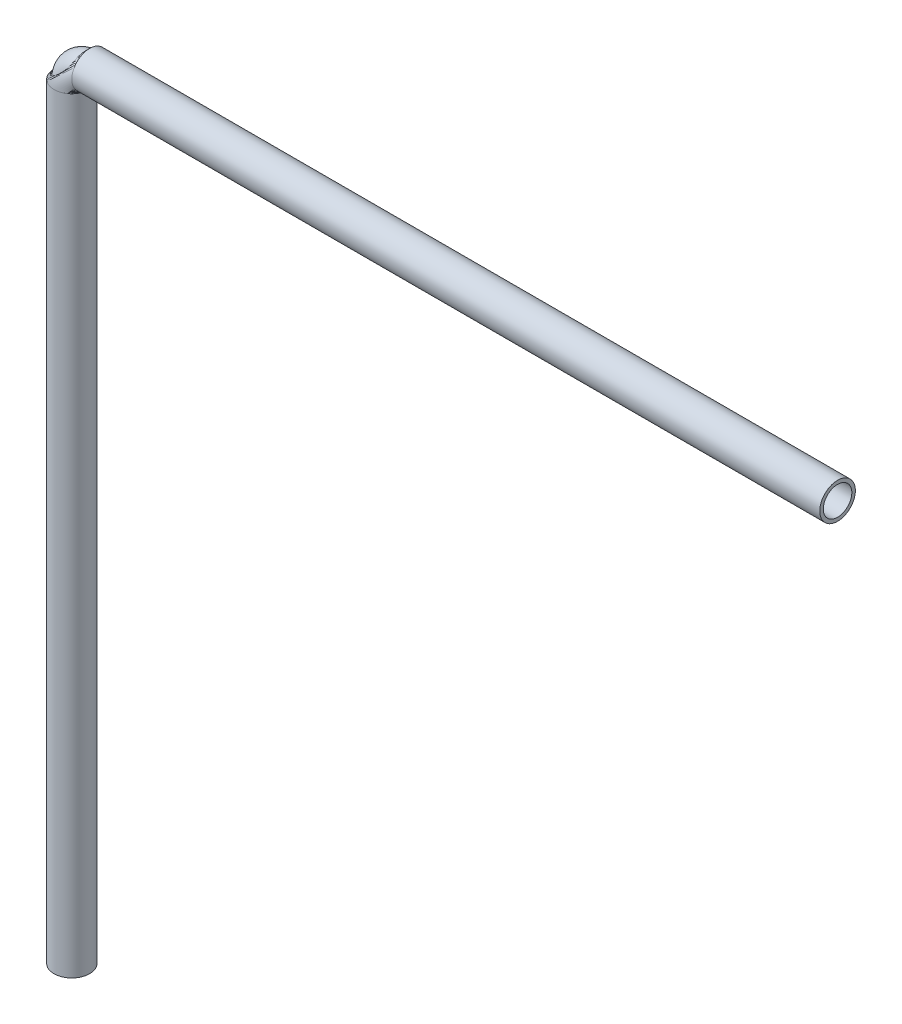
ISO-10303-21;
HEADER;
FILE_DESCRIPTION(('STEP AP214'),'2;1');
FILE_NAME('part.step','',(''),(''),'','','');
FILE_SCHEMA(('AUTOMOTIVE_DESIGN { 1 0 10303 214 1 1 1 1 }'));
ENDSEC;
DATA;
#1=APPLICATION_CONTEXT('core data for automotive mechanical design processes');
#2=APPLICATION_PROTOCOL_DEFINITION('international standard','automotive_design',2000,#1);
#3=PRODUCT_CONTEXT('',#1,'mechanical');
#4=PRODUCT('Part','Part','',(#3));
#5=PRODUCT_RELATED_PRODUCT_CATEGORY('part','',(#4));
#6=PRODUCT_DEFINITION_FORMATION('','',#4);
#7=PRODUCT_DEFINITION_CONTEXT('part definition',#1,'design');
#8=PRODUCT_DEFINITION('design','',#6,#7);
#9=PRODUCT_DEFINITION_SHAPE('','',#8);
#10=(LENGTH_UNIT() NAMED_UNIT(*) SI_UNIT(.MILLI.,.METRE.));
#11=(NAMED_UNIT(*) PLANE_ANGLE_UNIT() SI_UNIT($,.RADIAN.));
#12=(NAMED_UNIT(*) SI_UNIT($,.STERADIAN.) SOLID_ANGLE_UNIT());
#13=UNCERTAINTY_MEASURE_WITH_UNIT(LENGTH_MEASURE(1.E-05),#10,'distance_accuracy_value','');
#14=(GEOMETRIC_REPRESENTATION_CONTEXT(3) GLOBAL_UNCERTAINTY_ASSIGNED_CONTEXT((#13)) GLOBAL_UNIT_ASSIGNED_CONTEXT((#10,
#11,#12)) REPRESENTATION_CONTEXT('',''));
#15=CARTESIAN_POINT('',(0.,0.,0.));
#16=DIRECTION('',(0.,0.,1.));
#17=DIRECTION('',(1.,0.,0.));
#18=AXIS2_PLACEMENT_3D('',#15,#16,#17);
#19=CARTESIAN_POINT('',(0.,0.,0.));
#20=DIRECTION('',(0.,1.,0.));
#21=DIRECTION('',(0.,0.,1.));
#22=AXIS2_PLACEMENT_3D('',#19,#20,#21);
#23=CYLINDRICAL_SURFACE('',#22,0.5);
#24=CARTESIAN_POINT('',(0.,21.5,0.));
#25=DIRECTION('',(0.,1.,0.));
#26=DIRECTION('',(0.,0.,1.));
#27=AXIS2_PLACEMENT_3D('',#24,#25,#26);
#28=CIRCLE('',#27,0.5);
#29=CARTESIAN_POINT('',(0.5,21.5,0.));
#30=VERTEX_POINT('',#29);
#31=EDGE_CURVE('E65',#30,#30,#28,.T.);
#32=ORIENTED_EDGE('',*,*,#31,.F.);
#33=EDGE_LOOP('',(#32));
#34=FACE_BOUND('',#33,.T.);
#35=CARTESIAN_POINT('',(0.,0.,0.));
#36=DIRECTION('',(0.,1.,0.));
#37=DIRECTION('',(0.,0.,1.));
#38=AXIS2_PLACEMENT_3D('',#35,#36,#37);
#39=CIRCLE('',#38,0.5);
#40=CARTESIAN_POINT('',(0.,0.,0.5));
#41=VERTEX_POINT('',#40);
#42=EDGE_CURVE('E50',#41,#41,#39,.T.);
#43=ORIENTED_EDGE('',*,*,#42,.T.);
#44=EDGE_LOOP('',(#43));
#45=FACE_BOUND('',#44,.T.);
#46=ADVANCED_FACE('F35',(#34,#45),#23,.T.);
#47=CARTESIAN_POINT('',(0.5,21.5,0.));
#48=DIRECTION('',(0.,0.,-1.));
#49=DIRECTION('',(-1.,0.,0.));
#50=AXIS2_PLACEMENT_3D('',#47,#48,#49);
#51=TOROIDAL_SURFACE('',#50,0.5,0.5);
#52=CARTESIAN_POINT('',(0.5,22.,0.));
#53=DIRECTION('',(1.,0.,0.));
#54=DIRECTION('',(0.,0.,1.));
#55=AXIS2_PLACEMENT_3D('',#52,#53,#54);
#56=CIRCLE('',#55,0.5);
#57=EDGE_CURVE('E39',#30,#30,#56,.T.);
#58=ORIENTED_EDGE('',*,*,#57,.F.);
#59=ORIENTED_EDGE('',*,*,#31,.T.);
#60=EDGE_LOOP('',(#58,#59));
#61=FACE_BOUND('',#60,.T.);
#62=ADVANCED_FACE('F91',(#61),#51,.T.);
#63=CARTESIAN_POINT('',(0.5,22.,0.));
#64=DIRECTION('',(1.,0.,0.));
#65=DIRECTION('',(0.,0.,-1.));
#66=AXIS2_PLACEMENT_3D('',#63,#64,#65);
#67=CYLINDRICAL_SURFACE('',#66,0.5);
#68=CARTESIAN_POINT('',(21.5,22.,0.));
#69=DIRECTION('',(1.,0.,0.));
#70=DIRECTION('',(0.,0.,1.));
#71=AXIS2_PLACEMENT_3D('',#68,#69,#70);
#72=CIRCLE('',#71,0.5);
#73=CARTESIAN_POINT('',(21.5,22.,0.5));
#74=VERTEX_POINT('',#73);
#75=EDGE_CURVE('E56',#74,#74,#72,.T.);
#76=ORIENTED_EDGE('',*,*,#75,.F.);
#77=EDGE_LOOP('',(#76));
#78=FACE_BOUND('',#77,.T.);
#79=ORIENTED_EDGE('',*,*,#57,.T.);
#80=EDGE_LOOP('',(#79));
#81=FACE_BOUND('',#80,.T.);
#82=ADVANCED_FACE('F37',(#78,#81),#67,.T.);
#83=CARTESIAN_POINT('',(0.,0.,0.));
#84=DIRECTION('',(0.,1.,0.));
#85=DIRECTION('',(0.,0.,1.));
#86=AXIS2_PLACEMENT_3D('',#83,#84,#85);
#87=PLANE('',#86);
#88=CARTESIAN_POINT('',(0.,0.,0.));
#89=DIRECTION('',(0.,1.,0.));
#90=DIRECTION('',(0.,0.,1.));
#91=AXIS2_PLACEMENT_3D('',#88,#89,#90);
#92=CIRCLE('',#91,0.4);
#93=CARTESIAN_POINT('',(0.,0.,0.4));
#94=VERTEX_POINT('',#93);
#95=EDGE_CURVE('E82',#94,#94,#92,.F.);
#96=ORIENTED_EDGE('',*,*,#95,.F.);
#97=EDGE_LOOP('',(#96));
#98=FACE_BOUND('',#97,.T.);
#99=ORIENTED_EDGE('',*,*,#42,.F.);
#100=EDGE_LOOP('',(#99));
#101=FACE_BOUND('',#100,.T.);
#102=ADVANCED_FACE('F97',(#98,#101),#87,.F.);
#103=CARTESIAN_POINT('',(21.5,22.,0.));
#104=DIRECTION('',(1.,0.,0.));
#105=DIRECTION('',(0.,0.,1.));
#106=AXIS2_PLACEMENT_3D('',#103,#104,#105);
#107=PLANE('',#106);
#108=CARTESIAN_POINT('',(21.5,22.,0.));
#109=DIRECTION('',(1.,0.,0.));
#110=DIRECTION('',(0.,0.,1.));
#111=AXIS2_PLACEMENT_3D('',#108,#109,#110);
#112=CIRCLE('',#111,0.4);
#113=CARTESIAN_POINT('',(21.5,22.,0.4));
#114=VERTEX_POINT('',#113);
#115=EDGE_CURVE('E11',#114,#114,#112,.F.);
#116=ORIENTED_EDGE('',*,*,#115,.T.);
#117=EDGE_LOOP('',(#116));
#118=FACE_BOUND('',#117,.T.);
#119=ORIENTED_EDGE('',*,*,#75,.T.);
#120=EDGE_LOOP('',(#119));
#121=FACE_BOUND('',#120,.T.);
#122=ADVANCED_FACE('F68',(#118,#121),#107,.T.);
#123=CARTESIAN_POINT('',(0.,0.,0.));
#124=DIRECTION('',(0.,1.,0.));
#125=DIRECTION('',(0.,0.,1.));
#126=AXIS2_PLACEMENT_3D('',#123,#124,#125);
#127=CYLINDRICAL_SURFACE('',#126,0.4);
#128=CARTESIAN_POINT('',(0.,21.5,0.));
#129=DIRECTION('',(0.,1.,0.));
#130=DIRECTION('',(0.,0.,1.));
#131=AXIS2_PLACEMENT_3D('',#128,#129,#130);
#132=CIRCLE('',#131,0.4);
#133=CARTESIAN_POINT('',(-0.4,21.5,0.));
#134=VERTEX_POINT('',#133);
#135=EDGE_CURVE('E79',#134,#134,#132,.F.);
#136=ORIENTED_EDGE('',*,*,#135,.F.);
#137=EDGE_LOOP('',(#136));
#138=FACE_BOUND('',#137,.T.);
#139=ORIENTED_EDGE('',*,*,#95,.T.);
#140=EDGE_LOOP('',(#139));
#141=FACE_BOUND('',#140,.T.);
#142=ADVANCED_FACE('F104',(#138,#141),#127,.F.);
#143=CARTESIAN_POINT('',(0.5,21.5,0.));
#144=DIRECTION('',(0.,0.,-1.));
#145=DIRECTION('',(-1.,0.,0.));
#146=AXIS2_PLACEMENT_3D('',#143,#144,#145);
#147=TOROIDAL_SURFACE('',#146,0.5,0.4);
#148=CARTESIAN_POINT('',(0.5,22.,0.));
#149=DIRECTION('',(1.,0.,0.));
#150=DIRECTION('',(0.,0.,1.));
#151=AXIS2_PLACEMENT_3D('',#148,#149,#150);
#152=CIRCLE('',#151,0.4);
#153=CARTESIAN_POINT('',(0.5,22.4,0.));
#154=VERTEX_POINT('',#153);
#155=EDGE_CURVE('E44',#154,#154,#152,.F.);
#156=CARTESIAN_POINT('',(0.5,21.5,0.));
#157=DIRECTION('',(0.,0.,-1.));
#158=DIRECTION('',(-1.,0.,0.));
#159=AXIS2_PLACEMENT_3D('',#156,#157,#158);
#160=CIRCLE('',#159,0.9);
#161=EDGE_CURVE('',#134,#154,#160,.T.);
#162=ORIENTED_EDGE('',*,*,#135,.T.);
#163=ORIENTED_EDGE('',*,*,#155,.F.);
#164=ORIENTED_EDGE('',*,*,#161,.T.);
#165=ORIENTED_EDGE('',*,*,#161,.F.);
#166=EDGE_LOOP('',(#162,#164,#163,#165));
#167=FACE_BOUND('',#166,.T.);
#168=ADVANCED_FACE('F74',(#167),#147,.F.);
#169=CARTESIAN_POINT('',(0.5,22.,0.));
#170=DIRECTION('',(1.,0.,0.));
#171=DIRECTION('',(0.,0.,-1.));
#172=AXIS2_PLACEMENT_3D('',#169,#170,#171);
#173=CYLINDRICAL_SURFACE('',#172,0.4);
#174=ORIENTED_EDGE('',*,*,#115,.F.);
#175=EDGE_LOOP('',(#174));
#176=FACE_BOUND('',#175,.T.);
#177=ORIENTED_EDGE('',*,*,#155,.T.);
#178=EDGE_LOOP('',(#177));
#179=FACE_BOUND('',#178,.T.);
#180=ADVANCED_FACE('F71',(#176,#179),#173,.F.);
#181=CLOSED_SHELL('',(#46,#62,#82,#102,#122,#142,#168,#180));
#182=MANIFOLD_SOLID_BREP('B2',#181);
#183=ADVANCED_BREP_SHAPE_REPRESENTATION('',(#18,#182),#14);
#184=SHAPE_DEFINITION_REPRESENTATION(#9,#183);
ENDSEC;
END-ISO-10303-21;
